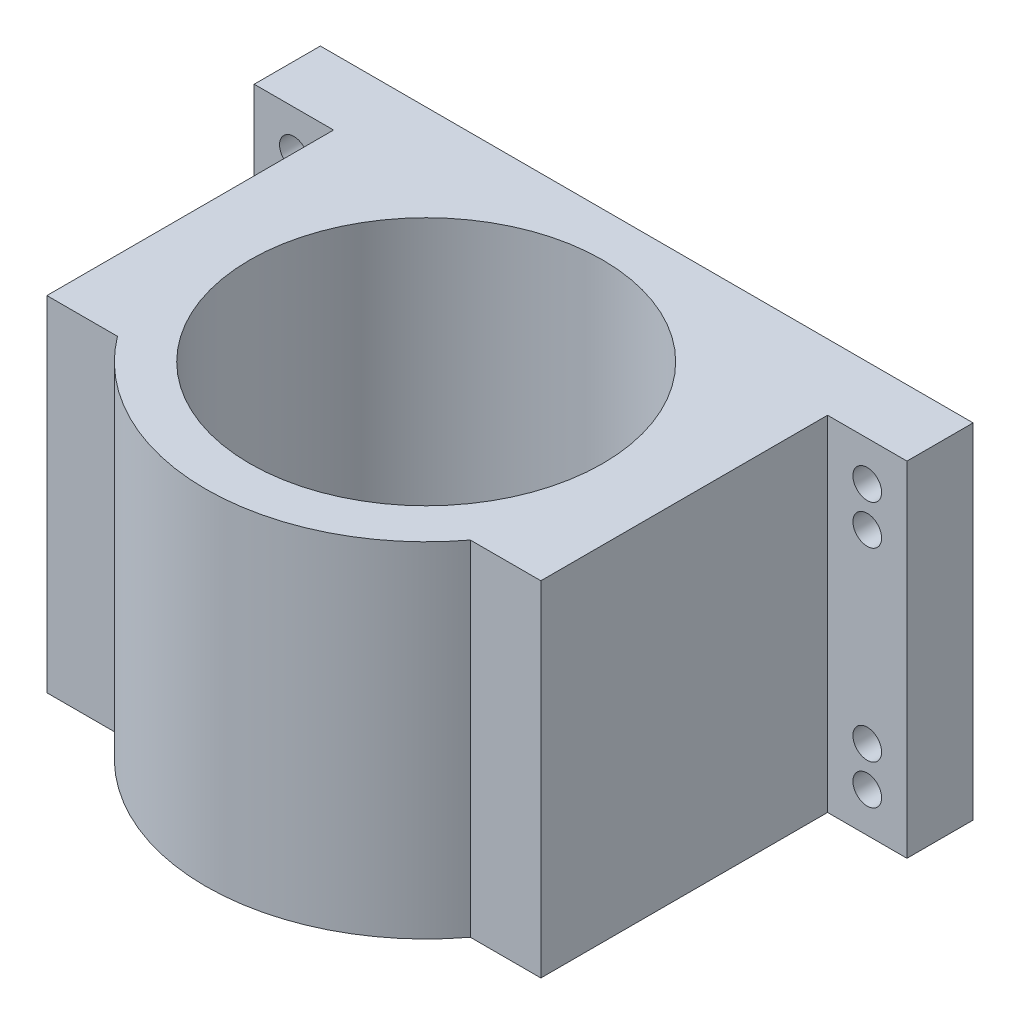
ISO-10303-21;
HEADER;
FILE_DESCRIPTION(('STEP AP214'),'2;1');
FILE_NAME('part.step','',(''),(''),'','','');
FILE_SCHEMA(('AUTOMOTIVE_DESIGN { 1 0 10303 214 1 1 1 1 }'));
ENDSEC;
DATA;
#1=APPLICATION_CONTEXT('core data for automotive mechanical design processes');
#2=APPLICATION_PROTOCOL_DEFINITION('international standard','automotive_design',2000,#1);
#3=PRODUCT_CONTEXT('',#1,'mechanical');
#4=PRODUCT('Part','Part','',(#3));
#5=PRODUCT_RELATED_PRODUCT_CATEGORY('part','',(#4));
#6=PRODUCT_DEFINITION_FORMATION('','',#4);
#7=PRODUCT_DEFINITION_CONTEXT('part definition',#1,'design');
#8=PRODUCT_DEFINITION('design','',#6,#7);
#9=PRODUCT_DEFINITION_SHAPE('','',#8);
#10=(LENGTH_UNIT() NAMED_UNIT(*) SI_UNIT(.MILLI.,.METRE.));
#11=(NAMED_UNIT(*) PLANE_ANGLE_UNIT() SI_UNIT($,.RADIAN.));
#12=(NAMED_UNIT(*) SI_UNIT($,.STERADIAN.) SOLID_ANGLE_UNIT());
#13=UNCERTAINTY_MEASURE_WITH_UNIT(LENGTH_MEASURE(1.E-05),#10,'distance_accuracy_value','');
#14=(GEOMETRIC_REPRESENTATION_CONTEXT(3) GLOBAL_UNCERTAINTY_ASSIGNED_CONTEXT((#13)) GLOBAL_UNIT_ASSIGNED_CONTEXT((#10,
#11,#12)) REPRESENTATION_CONTEXT('',''));
#15=CARTESIAN_POINT('',(0.,0.,0.));
#16=DIRECTION('',(0.,0.,1.));
#17=DIRECTION('',(1.,0.,0.));
#18=AXIS2_PLACEMENT_3D('',#15,#16,#17);
#19=CARTESIAN_POINT('',(0.,78.,-35.));
#20=DIRECTION('',(0.,0.,-1.));
#21=DIRECTION('',(-1.,0.,0.));
#22=AXIS2_PLACEMENT_3D('',#19,#20,#21);
#23=PLANE('',#22);
#24=CARTESIAN_POINT('',(-65.,18.,-35.));
#25=DIRECTION('',(0.,0.,1.));
#26=DIRECTION('',(1.,0.,0.));
#27=AXIS2_PLACEMENT_3D('',#24,#25,#26);
#28=CIRCLE('',#27,3.25);
#29=CARTESIAN_POINT('',(-61.75,18.,-35.));
#30=VERTEX_POINT('',#29);
#31=EDGE_CURVE('E452',#30,#30,#28,.T.);
#32=ORIENTED_EDGE('',*,*,#31,.F.);
#33=EDGE_LOOP('',(#32));
#34=FACE_BOUND('',#33,.T.);
#35=CARTESIAN_POINT('',(-65.,69.,-35.));
#36=DIRECTION('',(0.,0.,1.));
#37=DIRECTION('',(1.,0.,0.));
#38=AXIS2_PLACEMENT_3D('',#35,#36,#37);
#39=CIRCLE('',#38,3.25);
#40=CARTESIAN_POINT('',(-61.75,69.,-35.));
#41=VERTEX_POINT('',#40);
#42=EDGE_CURVE('E476',#41,#41,#39,.T.);
#43=ORIENTED_EDGE('',*,*,#42,.F.);
#44=EDGE_LOOP('',(#43));
#45=FACE_BOUND('',#44,.T.);
#46=CARTESIAN_POINT('',(-65.,60.,-35.));
#47=DIRECTION('',(0.,0.,1.));
#48=DIRECTION('',(1.,0.,0.));
#49=AXIS2_PLACEMENT_3D('',#46,#47,#48);
#50=CIRCLE('',#49,3.25);
#51=CARTESIAN_POINT('',(-61.75,60.,-35.));
#52=VERTEX_POINT('',#51);
#53=EDGE_CURVE('E510',#52,#52,#50,.T.);
#54=ORIENTED_EDGE('',*,*,#53,.F.);
#55=EDGE_LOOP('',(#54));
#56=FACE_BOUND('',#55,.T.);
#57=DIRECTION('',(1.,0.,0.));
#58=VECTOR('',#57,1.);
#59=CARTESIAN_POINT('',(0.,0.,-35.));
#60=LINE('',#59,#58);
#61=CARTESIAN_POINT('',(-74.,0.,-35.));
#62=VERTEX_POINT('',#61);
#63=CARTESIAN_POINT('',(-56.,0.,-35.));
#64=VERTEX_POINT('',#63);
#65=EDGE_CURVE('E99',#62,#64,#60,.T.);
#66=ORIENTED_EDGE('',*,*,#65,.T.);
#67=DIRECTION('',(0.,-1.,0.));
#68=VECTOR('',#67,1.);
#69=CARTESIAN_POINT('',(-56.,78.,-35.));
#70=LINE('',#69,#68);
#71=CARTESIAN_POINT('',(-56.,78.,-35.));
#72=VERTEX_POINT('',#71);
#73=EDGE_CURVE('E149',#72,#64,#70,.T.);
#74=ORIENTED_EDGE('',*,*,#73,.F.);
#75=DIRECTION('',(1.,0.,0.));
#76=VECTOR('',#75,1.);
#77=CARTESIAN_POINT('',(0.,78.,-35.));
#78=LINE('',#77,#76);
#79=CARTESIAN_POINT('',(-74.,78.,-35.));
#80=VERTEX_POINT('',#79);
#81=EDGE_CURVE('E138',#80,#72,#78,.T.);
#82=ORIENTED_EDGE('',*,*,#81,.F.);
#83=DIRECTION('',(0.,-1.,0.));
#84=VECTOR('',#83,1.);
#85=CARTESIAN_POINT('',(-74.,78.,-35.));
#86=LINE('',#85,#84);
#87=EDGE_CURVE('E144',#80,#62,#86,.T.);
#88=ORIENTED_EDGE('',*,*,#87,.T.);
#89=EDGE_LOOP('',(#66,#74,#82,#88));
#90=FACE_BOUND('',#89,.T.);
#91=CARTESIAN_POINT('',(-65.,8.99999999999999,-35.));
#92=DIRECTION('',(0.,0.,1.));
#93=DIRECTION('',(1.,0.,0.));
#94=AXIS2_PLACEMENT_3D('',#91,#92,#93);
#95=CIRCLE('',#94,3.25);
#96=CARTESIAN_POINT('',(-61.75,8.99999999999999,-35.));
#97=VERTEX_POINT('',#96);
#98=EDGE_CURVE('E448',#97,#97,#95,.T.);
#99=ORIENTED_EDGE('',*,*,#98,.F.);
#100=EDGE_LOOP('',(#99));
#101=FACE_BOUND('',#100,.T.);
#102=ADVANCED_FACE('F47',(#34,#45,#56,#90,#101),#23,.F.);
#103=CARTESIAN_POINT('',(0.,78.,30.));
#104=DIRECTION('',(0.,0.,-1.));
#105=DIRECTION('',(-1.,0.,0.));
#106=AXIS2_PLACEMENT_3D('',#103,#104,#105);
#107=PLANE('',#106);
#108=DIRECTION('',(1.,0.,0.));
#109=VECTOR('',#108,1.);
#110=CARTESIAN_POINT('',(0.,0.,30.));
#111=LINE('',#110,#109);
#112=CARTESIAN_POINT('',(-56.,0.,30.));
#113=VERTEX_POINT('',#112);
#114=CARTESIAN_POINT('',(-40.,0.,30.));
#115=VERTEX_POINT('',#114);
#116=EDGE_CURVE('E160',#113,#115,#111,.T.);
#117=ORIENTED_EDGE('',*,*,#116,.T.);
#118=DIRECTION('',(0.,-1.,0.));
#119=VECTOR('',#118,1.);
#120=CARTESIAN_POINT('',(-40.,78.,30.));
#121=LINE('',#120,#119);
#122=CARTESIAN_POINT('',(-40.,78.,30.));
#123=VERTEX_POINT('',#122);
#124=EDGE_CURVE('E12',#123,#115,#121,.T.);
#125=ORIENTED_EDGE('',*,*,#124,.F.);
#126=DIRECTION('',(1.,0.,0.));
#127=VECTOR('',#126,1.);
#128=CARTESIAN_POINT('',(0.,78.,30.));
#129=LINE('',#128,#127);
#130=CARTESIAN_POINT('',(-56.,78.,30.));
#131=VERTEX_POINT('',#130);
#132=EDGE_CURVE('E188',#131,#123,#129,.T.);
#133=ORIENTED_EDGE('',*,*,#132,.F.);
#134=DIRECTION('',(0.,-1.,0.));
#135=VECTOR('',#134,1.);
#136=CARTESIAN_POINT('',(-56.,78.,30.));
#137=LINE('',#136,#135);
#138=EDGE_CURVE('E159',#131,#113,#137,.T.);
#139=ORIENTED_EDGE('',*,*,#138,.T.);
#140=EDGE_LOOP('',(#117,#125,#133,#139));
#141=FACE_BOUND('',#140,.T.);
#142=ADVANCED_FACE('F49',(#141),#107,.F.);
#143=CARTESIAN_POINT('',(0.,78.,0.));
#144=DIRECTION('',(0.,-1.,0.));
#145=DIRECTION('',(0.,0.,-1.));
#146=AXIS2_PLACEMENT_3D('',#143,#144,#145);
#147=CYLINDRICAL_SURFACE('',#146,50.);
#148=CARTESIAN_POINT('',(0.,0.,0.));
#149=DIRECTION('',(0.,1.,0.));
#150=DIRECTION('',(0.,0.,1.));
#151=AXIS2_PLACEMENT_3D('',#148,#149,#150);
#152=CIRCLE('',#151,50.);
#153=CARTESIAN_POINT('',(40.,0.,30.));
#154=VERTEX_POINT('',#153);
#155=EDGE_CURVE('E163',#115,#154,#152,.T.);
#156=ORIENTED_EDGE('',*,*,#155,.T.);
#157=DIRECTION('',(0.,-1.,0.));
#158=VECTOR('',#157,1.);
#159=CARTESIAN_POINT('',(40.,78.,30.));
#160=LINE('',#159,#158);
#161=CARTESIAN_POINT('',(40.,78.,30.));
#162=VERTEX_POINT('',#161);
#163=EDGE_CURVE('E56',#162,#154,#160,.T.);
#164=ORIENTED_EDGE('',*,*,#163,.F.);
#165=CARTESIAN_POINT('',(0.,78.,0.));
#166=DIRECTION('',(0.,1.,0.));
#167=DIRECTION('',(0.,0.,1.));
#168=AXIS2_PLACEMENT_3D('',#165,#166,#167);
#169=CIRCLE('',#168,50.);
#170=EDGE_CURVE('E113',#123,#162,#169,.T.);
#171=ORIENTED_EDGE('',*,*,#170,.F.);
#172=ORIENTED_EDGE('',*,*,#124,.T.);
#173=EDGE_LOOP('',(#156,#164,#171,#172));
#174=FACE_BOUND('',#173,.T.);
#175=ADVANCED_FACE('F205',(#174),#147,.T.);
#176=CARTESIAN_POINT('',(0.,78.,30.));
#177=DIRECTION('',(0.,0.,1.));
#178=DIRECTION('',(1.,0.,0.));
#179=AXIS2_PLACEMENT_3D('',#176,#177,#178);
#180=PLANE('',#179);
#181=DIRECTION('',(-1.,0.,0.));
#182=VECTOR('',#181,1.);
#183=CARTESIAN_POINT('',(0.,0.,30.));
#184=LINE('',#183,#182);
#185=CARTESIAN_POINT('',(56.,0.,30.));
#186=VERTEX_POINT('',#185);
#187=EDGE_CURVE('E167',#186,#154,#184,.T.);
#188=ORIENTED_EDGE('',*,*,#187,.F.);
#189=DIRECTION('',(0.,-1.,0.));
#190=VECTOR('',#189,1.);
#191=CARTESIAN_POINT('',(56.,78.,30.));
#192=LINE('',#191,#190);
#193=CARTESIAN_POINT('',(56.,78.,30.));
#194=VERTEX_POINT('',#193);
#195=EDGE_CURVE('E198',#194,#186,#192,.T.);
#196=ORIENTED_EDGE('',*,*,#195,.F.);
#197=DIRECTION('',(-1.,0.,0.));
#198=VECTOR('',#197,1.);
#199=CARTESIAN_POINT('',(0.,78.,30.));
#200=LINE('',#199,#198);
#201=EDGE_CURVE('E204',#194,#162,#200,.T.);
#202=ORIENTED_EDGE('',*,*,#201,.T.);
#203=ORIENTED_EDGE('',*,*,#163,.T.);
#204=EDGE_LOOP('',(#188,#196,#202,#203));
#205=FACE_BOUND('',#204,.T.);
#206=ADVANCED_FACE('F202',(#205),#180,.T.);
#207=CARTESIAN_POINT('',(56.,78.,0.));
#208=DIRECTION('',(1.,0.,0.));
#209=DIRECTION('',(0.,0.,-1.));
#210=AXIS2_PLACEMENT_3D('',#207,#208,#209);
#211=PLANE('',#210);
#212=DIRECTION('',(0.,0.,1.));
#213=VECTOR('',#212,1.);
#214=CARTESIAN_POINT('',(56.,0.,0.));
#215=LINE('',#214,#213);
#216=CARTESIAN_POINT('',(56.,0.,-35.));
#217=VERTEX_POINT('',#216);
#218=EDGE_CURVE('E170',#217,#186,#215,.T.);
#219=ORIENTED_EDGE('',*,*,#218,.F.);
#220=DIRECTION('',(0.,-1.,0.));
#221=VECTOR('',#220,1.);
#222=CARTESIAN_POINT('',(56.,78.,-35.));
#223=LINE('',#222,#221);
#224=CARTESIAN_POINT('',(56.,78.,-35.));
#225=VERTEX_POINT('',#224);
#226=EDGE_CURVE('E196',#225,#217,#223,.T.);
#227=ORIENTED_EDGE('',*,*,#226,.F.);
#228=DIRECTION('',(0.,0.,1.));
#229=VECTOR('',#228,1.);
#230=CARTESIAN_POINT('',(56.,78.,0.));
#231=LINE('',#230,#229);
#232=EDGE_CURVE('E217',#225,#194,#231,.T.);
#233=ORIENTED_EDGE('',*,*,#232,.T.);
#234=ORIENTED_EDGE('',*,*,#195,.T.);
#235=EDGE_LOOP('',(#219,#227,#233,#234));
#236=FACE_BOUND('',#235,.T.);
#237=ADVANCED_FACE('F214',(#236),#211,.T.);
#238=CARTESIAN_POINT('',(0.,78.,-35.));
#239=DIRECTION('',(0.,0.,1.));
#240=DIRECTION('',(1.,0.,0.));
#241=AXIS2_PLACEMENT_3D('',#238,#239,#240);
#242=PLANE('',#241);
#243=CARTESIAN_POINT('',(65.,8.99999999999999,-35.));
#244=DIRECTION('',(0.,0.,1.));
#245=DIRECTION('',(1.,0.,0.));
#246=AXIS2_PLACEMENT_3D('',#243,#244,#245);
#247=CIRCLE('',#246,3.25);
#248=CARTESIAN_POINT('',(68.25,8.99999999999999,-35.));
#249=VERTEX_POINT('',#248);
#250=EDGE_CURVE('E462',#249,#249,#247,.T.);
#251=ORIENTED_EDGE('',*,*,#250,.F.);
#252=EDGE_LOOP('',(#251));
#253=FACE_BOUND('',#252,.T.);
#254=CARTESIAN_POINT('',(65.,18.,-35.));
#255=DIRECTION('',(0.,0.,1.));
#256=DIRECTION('',(1.,0.,0.));
#257=AXIS2_PLACEMENT_3D('',#254,#255,#256);
#258=CIRCLE('',#257,3.25);
#259=CARTESIAN_POINT('',(68.25,18.,-35.));
#260=VERTEX_POINT('',#259);
#261=EDGE_CURVE('E470',#260,#260,#258,.T.);
#262=ORIENTED_EDGE('',*,*,#261,.F.);
#263=EDGE_LOOP('',(#262));
#264=FACE_BOUND('',#263,.T.);
#265=CARTESIAN_POINT('',(65.,69.,-35.));
#266=DIRECTION('',(0.,0.,1.));
#267=DIRECTION('',(1.,0.,0.));
#268=AXIS2_PLACEMENT_3D('',#265,#266,#267);
#269=CIRCLE('',#268,3.25);
#270=CARTESIAN_POINT('',(68.25,69.,-35.));
#271=VERTEX_POINT('',#270);
#272=EDGE_CURVE('E486',#271,#271,#269,.T.);
#273=ORIENTED_EDGE('',*,*,#272,.F.);
#274=EDGE_LOOP('',(#273));
#275=FACE_BOUND('',#274,.T.);
#276=CARTESIAN_POINT('',(65.,60.,-35.));
#277=DIRECTION('',(0.,0.,1.));
#278=DIRECTION('',(1.,0.,0.));
#279=AXIS2_PLACEMENT_3D('',#276,#277,#278);
#280=CIRCLE('',#279,3.25);
#281=CARTESIAN_POINT('',(68.25,60.,-35.));
#282=VERTEX_POINT('',#281);
#283=EDGE_CURVE('E496',#282,#282,#280,.T.);
#284=ORIENTED_EDGE('',*,*,#283,.F.);
#285=EDGE_LOOP('',(#284));
#286=FACE_BOUND('',#285,.T.);
#287=DIRECTION('',(-1.,0.,0.));
#288=VECTOR('',#287,1.);
#289=CARTESIAN_POINT('',(0.,0.,-35.));
#290=LINE('',#289,#288);
#291=CARTESIAN_POINT('',(74.,0.,-35.));
#292=VERTEX_POINT('',#291);
#293=EDGE_CURVE('E173',#292,#217,#290,.T.);
#294=ORIENTED_EDGE('',*,*,#293,.F.);
#295=DIRECTION('',(0.,-1.,0.));
#296=VECTOR('',#295,1.);
#297=CARTESIAN_POINT('',(74.,78.,-35.));
#298=LINE('',#297,#296);
#299=CARTESIAN_POINT('',(74.,78.,-35.));
#300=VERTEX_POINT('',#299);
#301=EDGE_CURVE('E194',#300,#292,#298,.T.);
#302=ORIENTED_EDGE('',*,*,#301,.F.);
#303=DIRECTION('',(-1.,0.,0.));
#304=VECTOR('',#303,1.);
#305=CARTESIAN_POINT('',(0.,78.,-35.));
#306=LINE('',#305,#304);
#307=EDGE_CURVE('E221',#300,#225,#306,.T.);
#308=ORIENTED_EDGE('',*,*,#307,.T.);
#309=ORIENTED_EDGE('',*,*,#226,.T.);
#310=EDGE_LOOP('',(#294,#302,#308,#309));
#311=FACE_BOUND('',#310,.T.);
#312=ADVANCED_FACE('F261',(#253,#264,#275,#286,#311),#242,.T.);
#313=CARTESIAN_POINT('',(74.,78.,0.));
#314=DIRECTION('',(1.,0.,0.));
#315=DIRECTION('',(0.,0.,-1.));
#316=AXIS2_PLACEMENT_3D('',#313,#314,#315);
#317=PLANE('',#316);
#318=DIRECTION('',(0.,0.,1.));
#319=VECTOR('',#318,1.);
#320=CARTESIAN_POINT('',(74.,0.,0.));
#321=LINE('',#320,#319);
#322=CARTESIAN_POINT('',(74.,0.,-50.));
#323=VERTEX_POINT('',#322);
#324=EDGE_CURVE('E176',#323,#292,#321,.T.);
#325=ORIENTED_EDGE('',*,*,#324,.F.);
#326=DIRECTION('',(0.,-1.,0.));
#327=VECTOR('',#326,1.);
#328=CARTESIAN_POINT('',(74.,78.,-50.));
#329=LINE('',#328,#327);
#330=CARTESIAN_POINT('',(74.,78.,-50.));
#331=VERTEX_POINT('',#330);
#332=EDGE_CURVE('E192',#331,#323,#329,.T.);
#333=ORIENTED_EDGE('',*,*,#332,.F.);
#334=DIRECTION('',(0.,0.,1.));
#335=VECTOR('',#334,1.);
#336=CARTESIAN_POINT('',(74.,78.,0.));
#337=LINE('',#336,#335);
#338=EDGE_CURVE('E227',#331,#300,#337,.T.);
#339=ORIENTED_EDGE('',*,*,#338,.T.);
#340=ORIENTED_EDGE('',*,*,#301,.T.);
#341=EDGE_LOOP('',(#325,#333,#339,#340));
#342=FACE_BOUND('',#341,.T.);
#343=ADVANCED_FACE('F257',(#342),#317,.T.);
#344=CARTESIAN_POINT('',(0.,78.,-50.));
#345=DIRECTION('',(0.,0.,-1.));
#346=DIRECTION('',(-1.,0.,0.));
#347=AXIS2_PLACEMENT_3D('',#344,#345,#346);
#348=PLANE('',#347);
#349=CARTESIAN_POINT('',(-65.,8.99999999999999,-50.));
#350=DIRECTION('',(0.,0.,-1.));
#351=DIRECTION('',(-1.,0.,0.));
#352=AXIS2_PLACEMENT_3D('',#349,#350,#351);
#353=CIRCLE('',#352,3.25);
#354=CARTESIAN_POINT('',(-68.25,8.99999999999999,-50.));
#355=VERTEX_POINT('',#354);
#356=EDGE_CURVE('E451',#355,#355,#353,.T.);
#357=ORIENTED_EDGE('',*,*,#356,.F.);
#358=EDGE_LOOP('',(#357));
#359=FACE_BOUND('',#358,.T.);
#360=CARTESIAN_POINT('',(-65.,18.,-50.));
#361=DIRECTION('',(0.,0.,-1.));
#362=DIRECTION('',(-1.,0.,0.));
#363=AXIS2_PLACEMENT_3D('',#360,#361,#362);
#364=CIRCLE('',#363,3.25);
#365=CARTESIAN_POINT('',(-68.25,18.,-50.));
#366=VERTEX_POINT('',#365);
#367=EDGE_CURVE('E455',#366,#366,#364,.T.);
#368=ORIENTED_EDGE('',*,*,#367,.F.);
#369=EDGE_LOOP('',(#368));
#370=FACE_BOUND('',#369,.T.);
#371=CARTESIAN_POINT('',(65.,8.99999999999999,-50.));
#372=DIRECTION('',(0.,0.,-1.));
#373=DIRECTION('',(-1.,0.,0.));
#374=AXIS2_PLACEMENT_3D('',#371,#372,#373);
#375=CIRCLE('',#374,3.25);
#376=CARTESIAN_POINT('',(61.75,8.99999999999999,-50.));
#377=VERTEX_POINT('',#376);
#378=EDGE_CURVE('E467',#377,#377,#375,.T.);
#379=ORIENTED_EDGE('',*,*,#378,.F.);
#380=EDGE_LOOP('',(#379));
#381=FACE_BOUND('',#380,.T.);
#382=CARTESIAN_POINT('',(65.,18.,-50.));
#383=DIRECTION('',(0.,0.,-1.));
#384=DIRECTION('',(-1.,0.,0.));
#385=AXIS2_PLACEMENT_3D('',#382,#383,#384);
#386=CIRCLE('',#385,3.25);
#387=CARTESIAN_POINT('',(61.75,18.,-50.));
#388=VERTEX_POINT('',#387);
#389=EDGE_CURVE('E473',#388,#388,#386,.T.);
#390=ORIENTED_EDGE('',*,*,#389,.F.);
#391=EDGE_LOOP('',(#390));
#392=FACE_BOUND('',#391,.T.);
#393=CARTESIAN_POINT('',(-65.,69.,-50.));
#394=DIRECTION('',(0.,0.,-1.));
#395=DIRECTION('',(-1.,0.,0.));
#396=AXIS2_PLACEMENT_3D('',#393,#394,#395);
#397=CIRCLE('',#396,3.25);
#398=CARTESIAN_POINT('',(-68.25,69.,-50.));
#399=VERTEX_POINT('',#398);
#400=EDGE_CURVE('E481',#399,#399,#397,.T.);
#401=ORIENTED_EDGE('',*,*,#400,.F.);
#402=EDGE_LOOP('',(#401));
#403=FACE_BOUND('',#402,.T.);
#404=CARTESIAN_POINT('',(-65.,60.,-50.));
#405=DIRECTION('',(0.,0.,-1.));
#406=DIRECTION('',(-1.,0.,0.));
#407=AXIS2_PLACEMENT_3D('',#404,#405,#406);
#408=CIRCLE('',#407,3.25);
#409=CARTESIAN_POINT('',(-68.25,60.,-50.));
#410=VERTEX_POINT('',#409);
#411=EDGE_CURVE('E493',#410,#410,#408,.T.);
#412=ORIENTED_EDGE('',*,*,#411,.F.);
#413=EDGE_LOOP('',(#412));
#414=FACE_BOUND('',#413,.T.);
#415=CARTESIAN_POINT('',(65.,69.,-50.));
#416=DIRECTION('',(0.,0.,-1.));
#417=DIRECTION('',(-1.,0.,0.));
#418=AXIS2_PLACEMENT_3D('',#415,#416,#417);
#419=CIRCLE('',#418,3.25);
#420=CARTESIAN_POINT('',(61.75,69.,-50.));
#421=VERTEX_POINT('',#420);
#422=EDGE_CURVE('E492',#421,#421,#419,.T.);
#423=ORIENTED_EDGE('',*,*,#422,.F.);
#424=EDGE_LOOP('',(#423));
#425=FACE_BOUND('',#424,.T.);
#426=CARTESIAN_POINT('',(65.,60.,-50.));
#427=DIRECTION('',(0.,0.,-1.));
#428=DIRECTION('',(-1.,0.,0.));
#429=AXIS2_PLACEMENT_3D('',#426,#427,#428);
#430=CIRCLE('',#429,3.25);
#431=CARTESIAN_POINT('',(61.75,60.,-50.));
#432=VERTEX_POINT('',#431);
#433=EDGE_CURVE('E164',#432,#432,#430,.T.);
#434=ORIENTED_EDGE('',*,*,#433,.F.);
#435=EDGE_LOOP('',(#434));
#436=FACE_BOUND('',#435,.T.);
#437=DIRECTION('',(1.,0.,0.));
#438=VECTOR('',#437,1.);
#439=CARTESIAN_POINT('',(0.,0.,-50.));
#440=LINE('',#439,#438);
#441=CARTESIAN_POINT('',(-74.,0.,-50.));
#442=VERTEX_POINT('',#441);
#443=EDGE_CURVE('E179',#442,#323,#440,.T.);
#444=ORIENTED_EDGE('',*,*,#443,.F.);
#445=DIRECTION('',(0.,-1.,0.));
#446=VECTOR('',#445,1.);
#447=CARTESIAN_POINT('',(-74.,78.,-50.));
#448=LINE('',#447,#446);
#449=CARTESIAN_POINT('',(-74.,78.,-50.));
#450=VERTEX_POINT('',#449);
#451=EDGE_CURVE('E148',#450,#442,#448,.T.);
#452=ORIENTED_EDGE('',*,*,#451,.F.);
#453=DIRECTION('',(1.,0.,0.));
#454=VECTOR('',#453,1.);
#455=CARTESIAN_POINT('',(0.,78.,-50.));
#456=LINE('',#455,#454);
#457=EDGE_CURVE('E141',#450,#331,#456,.T.);
#458=ORIENTED_EDGE('',*,*,#457,.T.);
#459=ORIENTED_EDGE('',*,*,#332,.T.);
#460=EDGE_LOOP('',(#444,#452,#458,#459));
#461=FACE_BOUND('',#460,.T.);
#462=ADVANCED_FACE('F231',(#359,#370,#381,#392,#403,#414,#425,#436,#461),#348,.T.);
#463=CARTESIAN_POINT('',(-74.,78.,0.));
#464=DIRECTION('',(1.,0.,0.));
#465=DIRECTION('',(0.,0.,-1.));
#466=AXIS2_PLACEMENT_3D('',#463,#464,#465);
#467=PLANE('',#466);
#468=DIRECTION('',(0.,0.,1.));
#469=VECTOR('',#468,1.);
#470=CARTESIAN_POINT('',(-74.,0.,0.));
#471=LINE('',#470,#469);
#472=EDGE_CURVE('E147',#442,#62,#471,.T.);
#473=ORIENTED_EDGE('',*,*,#472,.T.);
#474=ORIENTED_EDGE('',*,*,#87,.F.);
#475=DIRECTION('',(0.,0.,1.));
#476=VECTOR('',#475,1.);
#477=CARTESIAN_POINT('',(-74.,78.,0.));
#478=LINE('',#477,#476);
#479=EDGE_CURVE('E133',#450,#80,#478,.T.);
#480=ORIENTED_EDGE('',*,*,#479,.F.);
#481=ORIENTED_EDGE('',*,*,#451,.T.);
#482=EDGE_LOOP('',(#473,#474,#480,#481));
#483=FACE_BOUND('',#482,.T.);
#484=ADVANCED_FACE('F145',(#483),#467,.F.);
#485=CARTESIAN_POINT('',(-56.,78.,0.));
#486=DIRECTION('',(1.,0.,0.));
#487=DIRECTION('',(0.,0.,-1.));
#488=AXIS2_PLACEMENT_3D('',#485,#486,#487);
#489=PLANE('',#488);
#490=DIRECTION('',(0.,0.,1.));
#491=VECTOR('',#490,1.);
#492=CARTESIAN_POINT('',(-56.,0.,0.));
#493=LINE('',#492,#491);
#494=EDGE_CURVE('E105',#64,#113,#493,.T.);
#495=ORIENTED_EDGE('',*,*,#494,.T.);
#496=ORIENTED_EDGE('',*,*,#138,.F.);
#497=DIRECTION('',(0.,0.,1.));
#498=VECTOR('',#497,1.);
#499=CARTESIAN_POINT('',(-56.,78.,0.));
#500=LINE('',#499,#498);
#501=EDGE_CURVE('E64',#72,#131,#500,.T.);
#502=ORIENTED_EDGE('',*,*,#501,.F.);
#503=ORIENTED_EDGE('',*,*,#73,.T.);
#504=EDGE_LOOP('',(#495,#496,#502,#503));
#505=FACE_BOUND('',#504,.T.);
#506=ADVANCED_FACE('F235',(#505),#489,.F.);
#507=CARTESIAN_POINT('',(0.,78.,0.));
#508=DIRECTION('',(0.,-1.,0.));
#509=DIRECTION('',(0.,0.,-1.));
#510=AXIS2_PLACEMENT_3D('',#507,#508,#509);
#511=CYLINDRICAL_SURFACE('',#510,40.);
#512=CARTESIAN_POINT('',(0.,78.,0.));
#513=DIRECTION('',(0.,1.,0.));
#514=DIRECTION('',(0.,0.,1.));
#515=AXIS2_PLACEMENT_3D('',#512,#513,#514);
#516=CIRCLE('',#515,40.);
#517=CARTESIAN_POINT('',(0.,78.,40.));
#518=VERTEX_POINT('',#517);
#519=EDGE_CURVE('E153',#518,#518,#516,.T.);
#520=ORIENTED_EDGE('',*,*,#519,.T.);
#521=EDGE_LOOP('',(#520));
#522=FACE_BOUND('',#521,.T.);
#523=CARTESIAN_POINT('',(0.,0.,0.));
#524=DIRECTION('',(0.,1.,0.));
#525=DIRECTION('',(0.,0.,1.));
#526=AXIS2_PLACEMENT_3D('',#523,#524,#525);
#527=CIRCLE('',#526,40.);
#528=CARTESIAN_POINT('',(0.,0.,40.));
#529=VERTEX_POINT('',#528);
#530=EDGE_CURVE('E185',#529,#529,#527,.T.);
#531=ORIENTED_EDGE('',*,*,#530,.F.);
#532=EDGE_LOOP('',(#531));
#533=FACE_BOUND('',#532,.T.);
#534=ADVANCED_FACE('F237',(#522,#533),#511,.F.);
#535=CARTESIAN_POINT('',(0.,78.,0.));
#536=DIRECTION('',(0.,1.,0.));
#537=DIRECTION('',(0.,0.,1.));
#538=AXIS2_PLACEMENT_3D('',#535,#536,#537);
#539=PLANE('',#538);
#540=ORIENTED_EDGE('',*,*,#132,.T.);
#541=ORIENTED_EDGE('',*,*,#170,.T.);
#542=ORIENTED_EDGE('',*,*,#201,.F.);
#543=ORIENTED_EDGE('',*,*,#232,.F.);
#544=ORIENTED_EDGE('',*,*,#307,.F.);
#545=ORIENTED_EDGE('',*,*,#338,.F.);
#546=ORIENTED_EDGE('',*,*,#457,.F.);
#547=ORIENTED_EDGE('',*,*,#479,.T.);
#548=ORIENTED_EDGE('',*,*,#81,.T.);
#549=ORIENTED_EDGE('',*,*,#501,.T.);
#550=EDGE_LOOP('',(#540,#541,#542,#543,#544,#545,#546,#547,#548,#549));
#551=FACE_BOUND('',#550,.T.);
#552=ORIENTED_EDGE('',*,*,#519,.F.);
#553=EDGE_LOOP('',(#552));
#554=FACE_BOUND('',#553,.T.);
#555=ADVANCED_FACE('F135',(#551,#554),#539,.T.);
#556=CARTESIAN_POINT('',(0.,0.,0.));
#557=DIRECTION('',(0.,1.,0.));
#558=DIRECTION('',(0.,0.,1.));
#559=AXIS2_PLACEMENT_3D('',#556,#557,#558);
#560=PLANE('',#559);
#561=ORIENTED_EDGE('',*,*,#116,.F.);
#562=ORIENTED_EDGE('',*,*,#494,.F.);
#563=ORIENTED_EDGE('',*,*,#65,.F.);
#564=ORIENTED_EDGE('',*,*,#472,.F.);
#565=ORIENTED_EDGE('',*,*,#443,.T.);
#566=ORIENTED_EDGE('',*,*,#324,.T.);
#567=ORIENTED_EDGE('',*,*,#293,.T.);
#568=ORIENTED_EDGE('',*,*,#218,.T.);
#569=ORIENTED_EDGE('',*,*,#187,.T.);
#570=ORIENTED_EDGE('',*,*,#155,.F.);
#571=EDGE_LOOP('',(#561,#562,#563,#564,#565,#566,#567,#568,#569,#570));
#572=FACE_BOUND('',#571,.T.);
#573=ORIENTED_EDGE('',*,*,#530,.T.);
#574=EDGE_LOOP('',(#573));
#575=FACE_BOUND('',#574,.T.);
#576=ADVANCED_FACE('F209',(#572,#575),#560,.F.);
#577=CARTESIAN_POINT('',(65.,60.,-35.));
#578=DIRECTION('',(0.,0.,1.));
#579=DIRECTION('',(1.,0.,0.));
#580=AXIS2_PLACEMENT_3D('',#577,#578,#579);
#581=CYLINDRICAL_SURFACE('',#580,3.25);
#582=ORIENTED_EDGE('',*,*,#283,.T.);
#583=EDGE_LOOP('',(#582));
#584=FACE_BOUND('',#583,.T.);
#585=ORIENTED_EDGE('',*,*,#433,.T.);
#586=EDGE_LOOP('',(#585));
#587=FACE_BOUND('',#586,.T.);
#588=ADVANCED_FACE('F329',(#584,#587),#581,.F.);
#589=CARTESIAN_POINT('',(65.,69.,-35.));
#590=DIRECTION('',(0.,0.,1.));
#591=DIRECTION('',(1.,0.,0.));
#592=AXIS2_PLACEMENT_3D('',#589,#590,#591);
#593=CYLINDRICAL_SURFACE('',#592,3.25);
#594=ORIENTED_EDGE('',*,*,#272,.T.);
#595=EDGE_LOOP('',(#594));
#596=FACE_BOUND('',#595,.T.);
#597=ORIENTED_EDGE('',*,*,#422,.T.);
#598=EDGE_LOOP('',(#597));
#599=FACE_BOUND('',#598,.T.);
#600=ADVANCED_FACE('F339',(#596,#599),#593,.F.);
#601=CARTESIAN_POINT('',(-65.,60.,-35.));
#602=DIRECTION('',(0.,0.,1.));
#603=DIRECTION('',(1.,0.,0.));
#604=AXIS2_PLACEMENT_3D('',#601,#602,#603);
#605=CYLINDRICAL_SURFACE('',#604,3.25);
#606=ORIENTED_EDGE('',*,*,#53,.T.);
#607=EDGE_LOOP('',(#606));
#608=FACE_BOUND('',#607,.T.);
#609=ORIENTED_EDGE('',*,*,#411,.T.);
#610=EDGE_LOOP('',(#609));
#611=FACE_BOUND('',#610,.T.);
#612=ADVANCED_FACE('F348',(#608,#611),#605,.F.);
#613=CARTESIAN_POINT('',(-65.,69.,-35.));
#614=DIRECTION('',(0.,0.,1.));
#615=DIRECTION('',(1.,0.,0.));
#616=AXIS2_PLACEMENT_3D('',#613,#614,#615);
#617=CYLINDRICAL_SURFACE('',#616,3.25);
#618=ORIENTED_EDGE('',*,*,#42,.T.);
#619=EDGE_LOOP('',(#618));
#620=FACE_BOUND('',#619,.T.);
#621=ORIENTED_EDGE('',*,*,#400,.T.);
#622=EDGE_LOOP('',(#621));
#623=FACE_BOUND('',#622,.T.);
#624=ADVANCED_FACE('F364',(#620,#623),#617,.F.);
#625=CARTESIAN_POINT('',(65.,18.,-35.));
#626=DIRECTION('',(0.,0.,1.));
#627=DIRECTION('',(1.,0.,0.));
#628=AXIS2_PLACEMENT_3D('',#625,#626,#627);
#629=CYLINDRICAL_SURFACE('',#628,3.25);
#630=ORIENTED_EDGE('',*,*,#261,.T.);
#631=EDGE_LOOP('',(#630));
#632=FACE_BOUND('',#631,.T.);
#633=ORIENTED_EDGE('',*,*,#389,.T.);
#634=EDGE_LOOP('',(#633));
#635=FACE_BOUND('',#634,.T.);
#636=ADVANCED_FACE('F374',(#632,#635),#629,.F.);
#637=CARTESIAN_POINT('',(65.,8.99999999999999,-35.));
#638=DIRECTION('',(0.,0.,1.));
#639=DIRECTION('',(1.,0.,0.));
#640=AXIS2_PLACEMENT_3D('',#637,#638,#639);
#641=CYLINDRICAL_SURFACE('',#640,3.25);
#642=ORIENTED_EDGE('',*,*,#250,.T.);
#643=EDGE_LOOP('',(#642));
#644=FACE_BOUND('',#643,.T.);
#645=ORIENTED_EDGE('',*,*,#378,.T.);
#646=EDGE_LOOP('',(#645));
#647=FACE_BOUND('',#646,.T.);
#648=ADVANCED_FACE('F384',(#644,#647),#641,.F.);
#649=CARTESIAN_POINT('',(-65.,18.,-35.));
#650=DIRECTION('',(0.,0.,1.));
#651=DIRECTION('',(1.,0.,0.));
#652=AXIS2_PLACEMENT_3D('',#649,#650,#651);
#653=CYLINDRICAL_SURFACE('',#652,3.25);
#654=ORIENTED_EDGE('',*,*,#31,.T.);
#655=EDGE_LOOP('',(#654));
#656=FACE_BOUND('',#655,.T.);
#657=ORIENTED_EDGE('',*,*,#367,.T.);
#658=EDGE_LOOP('',(#657));
#659=FACE_BOUND('',#658,.T.);
#660=ADVANCED_FACE('F394',(#656,#659),#653,.F.);
#661=CARTESIAN_POINT('',(-65.,8.99999999999999,-35.));
#662=DIRECTION('',(0.,0.,1.));
#663=DIRECTION('',(1.,0.,0.));
#664=AXIS2_PLACEMENT_3D('',#661,#662,#663);
#665=CYLINDRICAL_SURFACE('',#664,3.25);
#666=ORIENTED_EDGE('',*,*,#98,.T.);
#667=EDGE_LOOP('',(#666));
#668=FACE_BOUND('',#667,.T.);
#669=ORIENTED_EDGE('',*,*,#356,.T.);
#670=EDGE_LOOP('',(#669));
#671=FACE_BOUND('',#670,.T.);
#672=ADVANCED_FACE('F404',(#668,#671),#665,.F.);
#673=CLOSED_SHELL('',(#102,#142,#175,#206,#237,#312,#343,#462,#484,#506,#534,#555,#576,#588,
#600,#612,#624,#636,#648,#660,#672));
#674=MANIFOLD_SOLID_BREP('B2',#673);
#675=ADVANCED_BREP_SHAPE_REPRESENTATION('',(#18,#674),#14);
#676=SHAPE_DEFINITION_REPRESENTATION(#9,#675);
ENDSEC;
END-ISO-10303-21;
